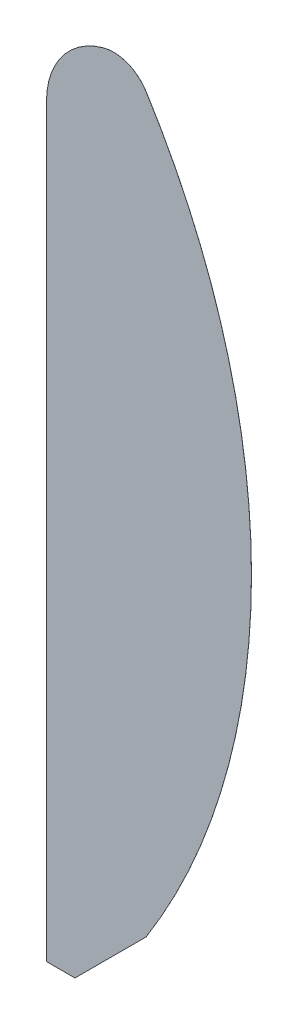
ISO-10303-21;
HEADER;
FILE_DESCRIPTION(('STEP AP214'),'2;1');
FILE_NAME('part.step','',(''),(''),'','','');
FILE_SCHEMA(('AUTOMOTIVE_DESIGN { 1 0 10303 214 1 1 1 1 }'));
ENDSEC;
DATA;
#1=APPLICATION_CONTEXT('core data for automotive mechanical design processes');
#2=APPLICATION_PROTOCOL_DEFINITION('international standard','automotive_design',2000,#1);
#3=PRODUCT_CONTEXT('',#1,'mechanical');
#4=PRODUCT('Part','Part','',(#3));
#5=PRODUCT_RELATED_PRODUCT_CATEGORY('part','',(#4));
#6=PRODUCT_DEFINITION_FORMATION('','',#4);
#7=PRODUCT_DEFINITION_CONTEXT('part definition',#1,'design');
#8=PRODUCT_DEFINITION('design','',#6,#7);
#9=PRODUCT_DEFINITION_SHAPE('','',#8);
#10=(LENGTH_UNIT() NAMED_UNIT(*) SI_UNIT(.MILLI.,.METRE.));
#11=(NAMED_UNIT(*) PLANE_ANGLE_UNIT() SI_UNIT($,.RADIAN.));
#12=(NAMED_UNIT(*) SI_UNIT($,.STERADIAN.) SOLID_ANGLE_UNIT());
#13=UNCERTAINTY_MEASURE_WITH_UNIT(LENGTH_MEASURE(1.E-05),#10,'distance_accuracy_value','');
#14=(GEOMETRIC_REPRESENTATION_CONTEXT(3) GLOBAL_UNCERTAINTY_ASSIGNED_CONTEXT((#13)) GLOBAL_UNIT_ASSIGNED_CONTEXT((#10,
#11,#12)) REPRESENTATION_CONTEXT('',''));
#15=CARTESIAN_POINT('',(0.,0.,0.));
#16=DIRECTION('',(0.,0.,1.));
#17=DIRECTION('',(1.,0.,0.));
#18=AXIS2_PLACEMENT_3D('',#15,#16,#17);
#19=CARTESIAN_POINT('',(0.,0.,0.01));
#20=DIRECTION('',(0.,1.,0.));
#21=DIRECTION('',(-1.,0.,0.));
#22=AXIS2_PLACEMENT_3D('',#19,#20,#21);
#23=PLANE('',#22);
#24=DIRECTION('',(1.,0.,0.));
#25=VECTOR('',#24,1.);
#26=CARTESIAN_POINT('',(0.,0.,0.));
#27=LINE('',#26,#25);
#28=CARTESIAN_POINT('',(0.,0.,0.));
#29=VERTEX_POINT('',#28);
#30=CARTESIAN_POINT('',(5.,0.,0.));
#31=VERTEX_POINT('',#30);
#32=EDGE_CURVE('E123',#29,#31,#27,.T.);
#33=ORIENTED_EDGE('',*,*,#32,.T.);
#34=DIRECTION('',(0.,0.,-1.));
#35=VECTOR('',#34,1.);
#36=CARTESIAN_POINT('',(5.,0.,0.01));
#37=LINE('',#36,#35);
#38=CARTESIAN_POINT('',(5.,0.,0.01));
#39=VERTEX_POINT('',#38);
#40=EDGE_CURVE('E11',#39,#31,#37,.T.);
#41=ORIENTED_EDGE('',*,*,#40,.F.);
#42=DIRECTION('',(1.,0.,0.));
#43=VECTOR('',#42,1.);
#44=CARTESIAN_POINT('',(0.,0.,0.01));
#45=LINE('',#44,#43);
#46=CARTESIAN_POINT('',(0.,0.,0.01));
#47=VERTEX_POINT('',#46);
#48=EDGE_CURVE('E136',#47,#39,#45,.T.);
#49=ORIENTED_EDGE('',*,*,#48,.F.);
#50=DIRECTION('',(0.,0.,-1.));
#51=VECTOR('',#50,1.);
#52=CARTESIAN_POINT('',(0.,0.,0.01));
#53=LINE('',#52,#51);
#54=EDGE_CURVE('E54',#47,#29,#53,.T.);
#55=ORIENTED_EDGE('',*,*,#54,.T.);
#56=EDGE_LOOP('',(#33,#41,#49,#55));
#57=FACE_BOUND('',#56,.T.);
#58=ADVANCED_FACE('F39',(#57),#23,.F.);
#59=CARTESIAN_POINT('',(5.,0.,0.01));
#60=DIRECTION('',(-0.707106781186547,0.707106781186547,0.));
#61=DIRECTION('',(-0.707106781186548,-0.707106781186548,0.));
#62=AXIS2_PLACEMENT_3D('',#59,#60,#61);
#63=PLANE('',#62);
#64=DIRECTION('',(0.707106781186547,0.707106781186547,0.));
#65=VECTOR('',#64,1.);
#66=CARTESIAN_POINT('',(5.,0.,0.));
#67=LINE('',#66,#65);
#68=CARTESIAN_POINT('',(17.4999999999999,12.4999999999999,0.));
#69=VERTEX_POINT('',#68);
#70=EDGE_CURVE('E124',#31,#69,#67,.T.);
#71=ORIENTED_EDGE('',*,*,#70,.T.);
#72=DIRECTION('',(0.,0.,-1.));
#73=VECTOR('',#72,1.);
#74=CARTESIAN_POINT('',(17.4999999999999,12.4999999999999,0.01));
#75=LINE('',#74,#73);
#76=CARTESIAN_POINT('',(17.4999999999999,12.4999999999999,0.01));
#77=VERTEX_POINT('',#76);
#78=EDGE_CURVE('E50',#77,#69,#75,.T.);
#79=ORIENTED_EDGE('',*,*,#78,.F.);
#80=DIRECTION('',(0.707106781186547,0.707106781186547,0.));
#81=VECTOR('',#80,1.);
#82=CARTESIAN_POINT('',(5.,0.,0.01));
#83=LINE('',#82,#81);
#84=EDGE_CURVE('E87',#39,#77,#83,.T.);
#85=ORIENTED_EDGE('',*,*,#84,.F.);
#86=ORIENTED_EDGE('',*,*,#40,.T.);
#87=EDGE_LOOP('',(#71,#79,#85,#86));
#88=FACE_BOUND('',#87,.T.);
#89=ADVANCED_FACE('F156',(#88),#63,.F.);
#90=CARTESIAN_POINT('',(-84.9525733030058,76.7883754049767,0.01));
#91=DIRECTION('',(0.,0.,-1.));
#92=DIRECTION('',(-1.,0.,0.));
#93=AXIS2_PLACEMENT_3D('',#90,#91,#92);
#94=CYLINDRICAL_SURFACE('',#93,120.952573303006);
#95=CARTESIAN_POINT('',(-84.9525733030058,76.7883754049767,0.));
#96=DIRECTION('',(0.,0.,1.));
#97=DIRECTION('',(1.,0.,0.));
#98=AXIS2_PLACEMENT_3D('',#95,#96,#97);
#99=CIRCLE('',#98,120.952573303006);
#100=CARTESIAN_POINT('',(17.5,141.076750809953,0.));
#101=VERTEX_POINT('',#100);
#102=EDGE_CURVE('E130',#69,#101,#99,.T.);
#103=ORIENTED_EDGE('',*,*,#102,.T.);
#104=DIRECTION('',(0.,0.,-1.));
#105=VECTOR('',#104,1.);
#106=CARTESIAN_POINT('',(17.5,141.076750809953,0.01));
#107=LINE('',#106,#105);
#108=CARTESIAN_POINT('',(17.5,141.076750809953,0.01));
#109=VERTEX_POINT('',#108);
#110=EDGE_CURVE('E106',#109,#101,#107,.T.);
#111=ORIENTED_EDGE('',*,*,#110,.F.);
#112=CARTESIAN_POINT('',(-84.9525733030058,76.7883754049767,0.01));
#113=DIRECTION('',(0.,0.,1.));
#114=DIRECTION('',(1.,0.,0.));
#115=AXIS2_PLACEMENT_3D('',#112,#113,#114);
#116=CIRCLE('',#115,120.952573303006);
#117=EDGE_CURVE('E111',#77,#109,#116,.T.);
#118=ORIENTED_EDGE('',*,*,#117,.F.);
#119=ORIENTED_EDGE('',*,*,#78,.T.);
#120=EDGE_LOOP('',(#103,#111,#118,#119));
#121=FACE_BOUND('',#120,.T.);
#122=ADVANCED_FACE('F142',(#121),#94,.T.);
#123=CARTESIAN_POINT('',(11.7817630780493,137.488591430045,0.01));
#124=DIRECTION('',(0.,0.,-1.));
#125=DIRECTION('',(-1.,0.,0.));
#126=AXIS2_PLACEMENT_3D('',#123,#124,#125);
#127=CYLINDRICAL_SURFACE('',#126,6.75078671202007);
#128=CARTESIAN_POINT('',(11.7817630780493,137.488591430045,0.));
#129=DIRECTION('',(0.,0.,-1.));
#130=DIRECTION('',(-1.,0.,0.));
#131=AXIS2_PLACEMENT_3D('',#128,#129,#130);
#132=CIRCLE('',#131,6.75078671202007);
#133=CARTESIAN_POINT('',(10.,144.,0.));
#134=VERTEX_POINT('',#133);
#135=EDGE_CURVE('E105',#134,#101,#132,.T.);
#136=ORIENTED_EDGE('',*,*,#135,.F.);
#137=DIRECTION('',(0.,0.,-1.));
#138=VECTOR('',#137,1.);
#139=CARTESIAN_POINT('',(10.,144.,0.01));
#140=LINE('',#139,#138);
#141=CARTESIAN_POINT('',(10.,144.,0.01));
#142=VERTEX_POINT('',#141);
#143=EDGE_CURVE('E100',#142,#134,#140,.T.);
#144=ORIENTED_EDGE('',*,*,#143,.F.);
#145=CARTESIAN_POINT('',(11.7817630780493,137.488591430045,0.01));
#146=DIRECTION('',(0.,0.,-1.));
#147=DIRECTION('',(-1.,0.,0.));
#148=AXIS2_PLACEMENT_3D('',#145,#146,#147);
#149=CIRCLE('',#148,6.75078671202007);
#150=EDGE_CURVE('E99',#142,#109,#149,.T.);
#151=ORIENTED_EDGE('',*,*,#150,.T.);
#152=ORIENTED_EDGE('',*,*,#110,.T.);
#153=EDGE_LOOP('',(#136,#144,#151,#152));
#154=FACE_BOUND('',#153,.T.);
#155=ADVANCED_FACE('F97',(#154),#127,.T.);
#156=CARTESIAN_POINT('',(13.5857408,130.896,0.01));
#157=DIRECTION('',(0.,0.,-1.));
#158=DIRECTION('',(-1.,0.,0.));
#159=AXIS2_PLACEMENT_3D('',#156,#157,#158);
#160=CYLINDRICAL_SURFACE('',#159,13.5857408);
#161=CARTESIAN_POINT('',(13.5857408,130.896,0.));
#162=DIRECTION('',(0.,0.,-1.));
#163=DIRECTION('',(-1.,0.,0.));
#164=AXIS2_PLACEMENT_3D('',#161,#162,#163);
#165=CIRCLE('',#164,13.5857408);
#166=CARTESIAN_POINT('',(0.,130.896,0.));
#167=VERTEX_POINT('',#166);
#168=EDGE_CURVE('E134',#167,#134,#165,.T.);
#169=ORIENTED_EDGE('',*,*,#168,.F.);
#170=DIRECTION('',(0.,0.,-1.));
#171=VECTOR('',#170,1.);
#172=CARTESIAN_POINT('',(0.,130.896,0.01));
#173=LINE('',#172,#171);
#174=CARTESIAN_POINT('',(0.,130.896,0.01));
#175=VERTEX_POINT('',#174);
#176=EDGE_CURVE('E73',#175,#167,#173,.T.);
#177=ORIENTED_EDGE('',*,*,#176,.F.);
#178=CARTESIAN_POINT('',(13.5857408,130.896,0.01));
#179=DIRECTION('',(0.,0.,-1.));
#180=DIRECTION('',(-1.,0.,0.));
#181=AXIS2_PLACEMENT_3D('',#178,#179,#180);
#182=CIRCLE('',#181,13.5857408);
#183=EDGE_CURVE('E115',#175,#142,#182,.T.);
#184=ORIENTED_EDGE('',*,*,#183,.T.);
#185=ORIENTED_EDGE('',*,*,#143,.T.);
#186=EDGE_LOOP('',(#169,#177,#184,#185));
#187=FACE_BOUND('',#186,.T.);
#188=ADVANCED_FACE('F116',(#187),#160,.T.);
#189=CARTESIAN_POINT('',(0.,0.,0.01));
#190=DIRECTION('',(-1.,0.,0.));
#191=DIRECTION('',(0.,-1.,0.));
#192=AXIS2_PLACEMENT_3D('',#189,#190,#191);
#193=PLANE('',#192);
#194=DIRECTION('',(0.,1.,0.));
#195=VECTOR('',#194,1.);
#196=CARTESIAN_POINT('',(0.,0.,0.));
#197=LINE('',#196,#195);
#198=EDGE_CURVE('E135',#29,#167,#197,.T.);
#199=ORIENTED_EDGE('',*,*,#198,.F.);
#200=ORIENTED_EDGE('',*,*,#54,.F.);
#201=DIRECTION('',(0.,1.,0.));
#202=VECTOR('',#201,1.);
#203=CARTESIAN_POINT('',(0.,0.,0.01));
#204=LINE('',#203,#202);
#205=EDGE_CURVE('E120',#47,#175,#204,.T.);
#206=ORIENTED_EDGE('',*,*,#205,.T.);
#207=ORIENTED_EDGE('',*,*,#176,.T.);
#208=EDGE_LOOP('',(#199,#200,#206,#207));
#209=FACE_BOUND('',#208,.T.);
#210=ADVANCED_FACE('F144',(#209),#193,.T.);
#211=CARTESIAN_POINT('',(-84.9525733030058,76.7883754049767,0.01));
#212=DIRECTION('',(0.,0.,1.));
#213=DIRECTION('',(1.,0.,0.));
#214=AXIS2_PLACEMENT_3D('',#211,#212,#213);
#215=PLANE('',#214);
#216=ORIENTED_EDGE('',*,*,#48,.T.);
#217=ORIENTED_EDGE('',*,*,#84,.T.);
#218=ORIENTED_EDGE('',*,*,#117,.T.);
#219=ORIENTED_EDGE('',*,*,#150,.F.);
#220=ORIENTED_EDGE('',*,*,#183,.F.);
#221=ORIENTED_EDGE('',*,*,#205,.F.);
#222=EDGE_LOOP('',(#216,#217,#218,#219,#220,#221));
#223=FACE_BOUND('',#222,.T.);
#224=ADVANCED_FACE('F109',(#223),#215,.T.);
#225=CARTESIAN_POINT('',(-84.9525733030058,76.7883754049767,0.));
#226=DIRECTION('',(0.,0.,1.));
#227=DIRECTION('',(1.,0.,0.));
#228=AXIS2_PLACEMENT_3D('',#225,#226,#227);
#229=PLANE('',#228);
#230=ORIENTED_EDGE('',*,*,#32,.F.);
#231=ORIENTED_EDGE('',*,*,#198,.T.);
#232=ORIENTED_EDGE('',*,*,#168,.T.);
#233=ORIENTED_EDGE('',*,*,#135,.T.);
#234=ORIENTED_EDGE('',*,*,#102,.F.);
#235=ORIENTED_EDGE('',*,*,#70,.F.);
#236=EDGE_LOOP('',(#230,#231,#232,#233,#234,#235));
#237=FACE_BOUND('',#236,.T.);
#238=ADVANCED_FACE('F145',(#237),#229,.F.);
#239=CLOSED_SHELL('',(#58,#89,#122,#155,#188,#210,#224,#238));
#240=MANIFOLD_SOLID_BREP('B2',#239);
#241=ADVANCED_BREP_SHAPE_REPRESENTATION('',(#18,#240),#14);
#242=SHAPE_DEFINITION_REPRESENTATION(#9,#241);
ENDSEC;
END-ISO-10303-21;
